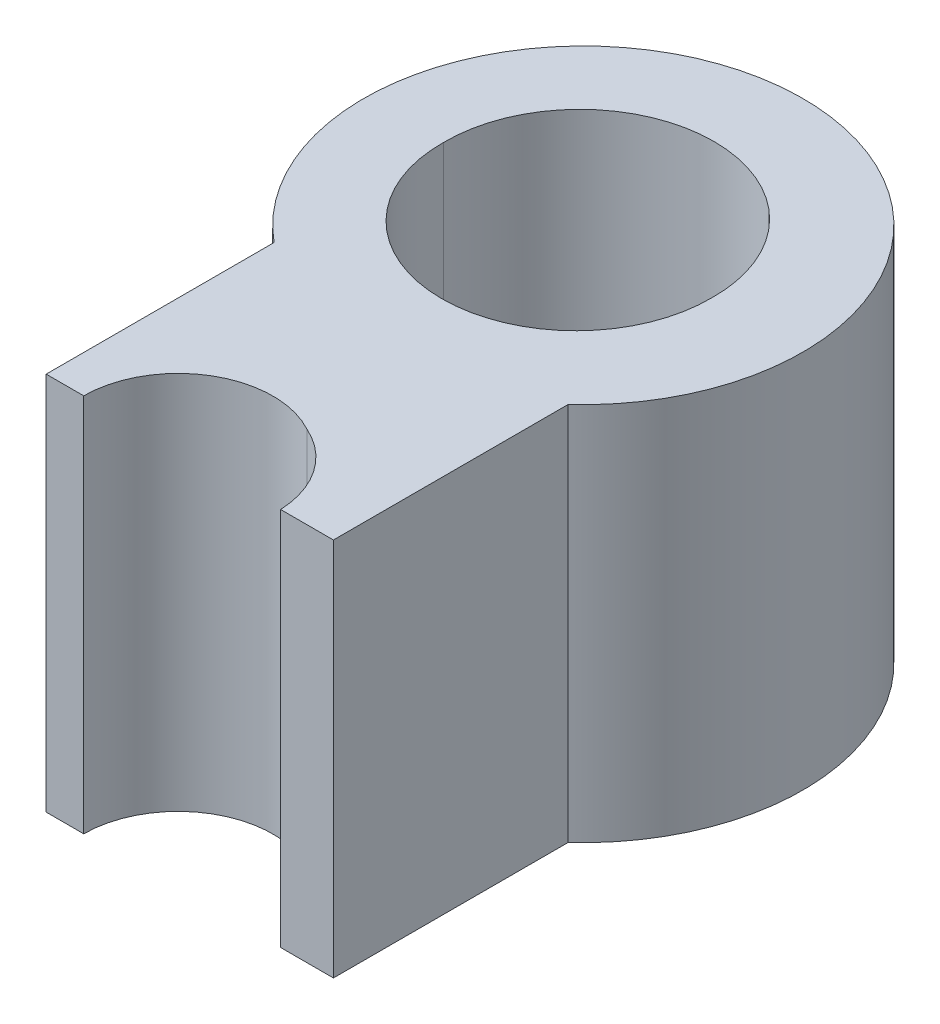
ISO-10303-21;
HEADER;
FILE_DESCRIPTION(('STEP AP214'),'2;1');
FILE_NAME('part.step','',(''),(''),'','','');
FILE_SCHEMA(('AUTOMOTIVE_DESIGN { 1 0 10303 214 1 1 1 1 }'));
ENDSEC;
DATA;
#1=APPLICATION_CONTEXT('core data for automotive mechanical design processes');
#2=APPLICATION_PROTOCOL_DEFINITION('international standard','automotive_design',2000,#1);
#3=PRODUCT_CONTEXT('',#1,'mechanical');
#4=PRODUCT('Part','Part','',(#3));
#5=PRODUCT_RELATED_PRODUCT_CATEGORY('part','',(#4));
#6=PRODUCT_DEFINITION_FORMATION('','',#4);
#7=PRODUCT_DEFINITION_CONTEXT('part definition',#1,'design');
#8=PRODUCT_DEFINITION('design','',#6,#7);
#9=PRODUCT_DEFINITION_SHAPE('','',#8);
#10=(LENGTH_UNIT() NAMED_UNIT(*) SI_UNIT(.MILLI.,.METRE.));
#11=(NAMED_UNIT(*) PLANE_ANGLE_UNIT() SI_UNIT($,.RADIAN.));
#12=(NAMED_UNIT(*) SI_UNIT($,.STERADIAN.) SOLID_ANGLE_UNIT());
#13=UNCERTAINTY_MEASURE_WITH_UNIT(LENGTH_MEASURE(1.E-05),#10,'distance_accuracy_value','');
#14=(GEOMETRIC_REPRESENTATION_CONTEXT(3) GLOBAL_UNCERTAINTY_ASSIGNED_CONTEXT((#13)) GLOBAL_UNIT_ASSIGNED_CONTEXT((#10,
#11,#12)) REPRESENTATION_CONTEXT('',''));
#15=CARTESIAN_POINT('',(0.,0.,0.));
#16=DIRECTION('',(0.,0.,1.));
#17=DIRECTION('',(1.,0.,0.));
#18=AXIS2_PLACEMENT_3D('',#15,#16,#17);
#19=CARTESIAN_POINT('',(1.26536763995187,2.87183105039429,15.59112871048));
#20=DIRECTION('',(0.,1.,0.));
#21=DIRECTION('',(0.,0.,-1.));
#22=AXIS2_PLACEMENT_3D('',#19,#20,#21);
#23=PLANE('',#22);
#24=CARTESIAN_POINT('',(6.25646763995183,2.87183105039429,23.2098996244558));
#25=DIRECTION('',(0.,1.,0.));
#26=DIRECTION('',(0.,0.,-1.));
#27=AXIS2_PLACEMENT_3D('',#24,#25,#26);
#28=CIRCLE('',#27,0.425);
#29=CARTESIAN_POINT('',(5.8315063422633,2.87183105039429,23.2041641674663));
#30=VERTEX_POINT('',#29);
#31=CARTESIAN_POINT('',(6.6814289376404,2.87183105039429,23.2041641674687));
#32=VERTEX_POINT('',#31);
#33=EDGE_CURVE('E208',#30,#32,#28,.T.);
#34=ORIENTED_EDGE('',*,*,#33,.F.);
#35=CARTESIAN_POINT('',(6.25646763995186,2.87183105039429,23.1984287104753));
#36=DIRECTION('',(0.,1.,0.));
#37=DIRECTION('',(0.,0.,1.));
#38=AXIS2_PLACEMENT_3D('',#35,#36,#37);
#39=CIRCLE('',#38,0.425);
#40=EDGE_CURVE('E115',#32,#30,#39,.T.);
#41=ORIENTED_EDGE('',*,*,#40,.F.);
#42=EDGE_LOOP('',(#34,#41));
#43=FACE_BOUND('',#42,.T.);
#44=CARTESIAN_POINT('',(6.27955042685121,2.87183105039429,24.4798996244558));
#45=DIRECTION('',(0.,1.,0.));
#46=DIRECTION('',(0.999103542626486,0.,-0.0423333333344553));
#47=AXIS2_PLACEMENT_3D('',#44,#45,#46);
#48=CIRCLE('',#47,0.299999999999992);
#49=CARTESIAN_POINT('',(6.57928148963915,2.87183105039429,24.4671996244555));
#50=VERTEX_POINT('',#49);
#51=CARTESIAN_POINT('',(6.40139322078209,2.87183105039429,24.2057567172575));
#52=VERTEX_POINT('',#51);
#53=EDGE_CURVE('E108',#50,#52,#48,.T.);
#54=ORIENTED_EDGE('',*,*,#53,.F.);
#55=DIRECTION('',(-1.,0.,-1.06337566312106E-12));
#56=VECTOR('',#55,1.);
#57=CARTESIAN_POINT('',(6.74636523073383,2.87183105039429,24.4671996244556));
#58=LINE('',#57,#56);
#59=CARTESIAN_POINT('',(6.74636523073383,2.87183105039429,24.4671996244556));
#60=VERTEX_POINT('',#59);
#61=EDGE_CURVE('E95',#60,#50,#58,.T.);
#62=ORIENTED_EDGE('',*,*,#61,.F.);
#63=DIRECTION('',(5.02522919053297E-13,0.,-1.));
#64=VECTOR('',#63,1.);
#65=CARTESIAN_POINT('',(6.74636523073383,2.87183105039429,24.4671996244556));
#66=LINE('',#65,#64);
#67=CARTESIAN_POINT('',(6.7463652307342,2.87183105039429,23.7245472516448));
#68=VERTEX_POINT('',#67);
#69=EDGE_CURVE('E26',#60,#68,#66,.T.);
#70=ORIENTED_EDGE('',*,*,#69,.T.);
#71=CARTESIAN_POINT('',(6.27955042685119,2.87183105039429,23.2098996244558));
#72=DIRECTION('',(0.,1.,0.));
#73=DIRECTION('',(0.,0.,-1.));
#74=AXIS2_PLACEMENT_3D('',#71,#72,#73);
#75=CIRCLE('',#74,0.694822453073876);
#76=CARTESIAN_POINT('',(5.83767133797172,2.87183105039429,23.7461095759735));
#77=VERTEX_POINT('',#76);
#78=EDGE_CURVE('E11',#68,#77,#75,.T.);
#79=ORIENTED_EDGE('',*,*,#78,.T.);
#80=DIRECTION('',(-5.6636748734305E-13,0.,-1.));
#81=VECTOR('',#80,1.);
#82=CARTESIAN_POINT('',(5.83767133797213,2.87183105039429,24.467199624456));
#83=LINE('',#82,#81);
#84=CARTESIAN_POINT('',(5.83767133797213,2.87183105039429,24.467199624456));
#85=VERTEX_POINT('',#84);
#86=EDGE_CURVE('E149',#85,#77,#83,.T.);
#87=ORIENTED_EDGE('',*,*,#86,.F.);
#88=DIRECTION('',(1.,0.,-1.62432664225037E-12));
#89=VECTOR('',#88,1.);
#90=CARTESIAN_POINT('',(5.83767133797213,2.87183105039429,24.467199624456));
#91=LINE('',#90,#89);
#92=CARTESIAN_POINT('',(5.9564701577165,2.87183105039429,24.4671996244558));
#93=VERTEX_POINT('',#92);
#94=EDGE_CURVE('E157',#85,#93,#91,.T.);
#95=ORIENTED_EDGE('',*,*,#94,.T.);
#96=CARTESIAN_POINT('',(6.25646763995186,2.87183105039429,24.4684287104753));
#97=DIRECTION('',(0.,1.,0.));
#98=DIRECTION('',(0.999103542626666,0.,0.04233333333019));
#99=AXIS2_PLACEMENT_3D('',#96,#97,#98);
#100=CIRCLE('',#99,0.300000000000009);
#101=EDGE_CURVE('E110',#52,#93,#100,.T.);
#102=ORIENTED_EDGE('',*,*,#101,.F.);
#103=EDGE_LOOP('',(#54,#62,#70,#79,#87,#95,#102));
#104=FACE_BOUND('',#103,.T.);
#105=ADVANCED_FACE('F17',(#43,#104),#23,.T.);
#106=CARTESIAN_POINT('',(6.27955042685119,2.87183105039429,23.2098996244558));
#107=DIRECTION('',(0.,-1.,0.));
#108=DIRECTION('',(0.,0.,-1.));
#109=AXIS2_PLACEMENT_3D('',#106,#107,#108);
#110=CYLINDRICAL_SURFACE('',#109,0.694822453073876);
#111=CARTESIAN_POINT('',(6.27955042685119,1.6718310055699,23.2098996244558));
#112=DIRECTION('',(0.,1.,0.));
#113=DIRECTION('',(0.,0.,-1.));
#114=AXIS2_PLACEMENT_3D('',#111,#112,#113);
#115=CIRCLE('',#114,0.694822453073876);
#116=CARTESIAN_POINT('',(6.74636523073421,1.6718310055699,23.7245472516448));
#117=VERTEX_POINT('',#116);
#118=CARTESIAN_POINT('',(5.83767133797173,1.6718310055699,23.7461095759735));
#119=VERTEX_POINT('',#118);
#120=EDGE_CURVE('E196',#117,#119,#115,.T.);
#121=ORIENTED_EDGE('',*,*,#120,.T.);
#122=DIRECTION('',(0.,-1.,0.));
#123=VECTOR('',#122,1.);
#124=CARTESIAN_POINT('',(5.83767133797172,2.87183105039429,23.7461095759735));
#125=LINE('',#124,#123);
#126=EDGE_CURVE('E153',#77,#119,#125,.T.);
#127=ORIENTED_EDGE('',*,*,#126,.F.);
#128=ORIENTED_EDGE('',*,*,#78,.F.);
#129=DIRECTION('',(0.,-1.,0.));
#130=VECTOR('',#129,1.);
#131=CARTESIAN_POINT('',(6.7463652307342,2.87183105039429,23.7245472516448));
#132=LINE('',#131,#130);
#133=EDGE_CURVE('E105',#68,#117,#132,.T.);
#134=ORIENTED_EDGE('',*,*,#133,.T.);
#135=EDGE_LOOP('',(#121,#127,#128,#134));
#136=FACE_BOUND('',#135,.T.);
#137=ADVANCED_FACE('F241',(#136),#110,.T.);
#138=CARTESIAN_POINT('',(6.7463652307342,2.87183105039429,23.7245472516448));
#139=DIRECTION('',(1.,0.,5.02522919053297E-13));
#140=DIRECTION('',(-5.02522919053297E-13,0.,1.));
#141=AXIS2_PLACEMENT_3D('',#138,#139,#140);
#142=PLANE('',#141);
#143=DIRECTION('',(5.02522919053297E-13,0.,-1.));
#144=VECTOR('',#143,1.);
#145=CARTESIAN_POINT('',(6.74636523073625,1.6718310055699,19.6578379810638));
#146=LINE('',#145,#144);
#147=CARTESIAN_POINT('',(6.74636523073384,1.6718310055699,24.4671996244556));
#148=VERTEX_POINT('',#147);
#149=EDGE_CURVE('E199',#148,#117,#146,.T.);
#150=ORIENTED_EDGE('',*,*,#149,.T.);
#151=ORIENTED_EDGE('',*,*,#133,.F.);
#152=ORIENTED_EDGE('',*,*,#69,.F.);
#153=DIRECTION('',(0.,-1.,0.));
#154=VECTOR('',#153,1.);
#155=CARTESIAN_POINT('',(6.74636523073383,2.87183105039429,24.4671996244556));
#156=LINE('',#155,#154);
#157=EDGE_CURVE('E102',#60,#148,#156,.T.);
#158=ORIENTED_EDGE('',*,*,#157,.T.);
#159=EDGE_LOOP('',(#150,#151,#152,#158));
#160=FACE_BOUND('',#159,.T.);
#161=ADVANCED_FACE('F246',(#160),#142,.T.);
#162=CARTESIAN_POINT('',(6.74636523073383,2.87183105039429,24.4671996244556));
#163=DIRECTION('',(-1.06337566312106E-12,0.,1.));
#164=DIRECTION('',(1.,0.,1.06337566312106E-12));
#165=AXIS2_PLACEMENT_3D('',#162,#163,#164);
#166=PLANE('',#165);
#167=DIRECTION('',(1.,0.,1.06337566312106E-12));
#168=VECTOR('',#167,1.);
#169=CARTESIAN_POINT('',(4.00586643533813,1.6718310055699,24.4671996244527));
#170=LINE('',#169,#168);
#171=CARTESIAN_POINT('',(6.57928148963915,1.6718310055699,24.4671996244555));
#172=VERTEX_POINT('',#171);
#173=EDGE_CURVE('E179',#172,#148,#170,.T.);
#174=ORIENTED_EDGE('',*,*,#173,.T.);
#175=ORIENTED_EDGE('',*,*,#157,.F.);
#176=ORIENTED_EDGE('',*,*,#61,.T.);
#177=DIRECTION('',(0.,-1.,0.));
#178=VECTOR('',#177,1.);
#179=CARTESIAN_POINT('',(6.57928148963915,2.87183105039429,24.4671996244555));
#180=LINE('',#179,#178);
#181=EDGE_CURVE('E100',#50,#172,#180,.T.);
#182=ORIENTED_EDGE('',*,*,#181,.T.);
#183=EDGE_LOOP('',(#174,#175,#176,#182));
#184=FACE_BOUND('',#183,.T.);
#185=ADVANCED_FACE('F98',(#184),#166,.T.);
#186=CARTESIAN_POINT('',(6.25646763995186,2.87183105039429,23.1984287104753));
#187=DIRECTION('',(0.,-1.,0.));
#188=DIRECTION('',(2.75833766230375E-12,0.,-1.));
#189=AXIS2_PLACEMENT_3D('',#186,#187,#188);
#190=CYLINDRICAL_SURFACE('',#189,0.425);
#191=CARTESIAN_POINT('',(6.25646763995186,1.6718310055699,23.1984287104753));
#192=DIRECTION('',(0.,-1.,0.));
#193=DIRECTION('',(0.,0.,1.));
#194=AXIS2_PLACEMENT_3D('',#191,#192,#193);
#195=CIRCLE('',#194,0.425);
#196=CARTESIAN_POINT('',(5.8315063422633,1.6718310055699,23.2041641674663));
#197=VERTEX_POINT('',#196);
#198=CARTESIAN_POINT('',(6.68142893764041,1.6718310055699,23.2041641674687));
#199=VERTEX_POINT('',#198);
#200=EDGE_CURVE('E189',#197,#199,#195,.T.);
#201=ORIENTED_EDGE('',*,*,#200,.T.);
#202=DIRECTION('',(0.,-1.,0.));
#203=VECTOR('',#202,1.);
#204=CARTESIAN_POINT('',(6.6814289376404,2.87183105039429,23.2041641674687));
#205=LINE('',#204,#203);
#206=EDGE_CURVE('E147',#32,#199,#205,.T.);
#207=ORIENTED_EDGE('',*,*,#206,.F.);
#208=ORIENTED_EDGE('',*,*,#40,.T.);
#209=DIRECTION('',(0.,-1.,0.));
#210=VECTOR('',#209,1.);
#211=CARTESIAN_POINT('',(5.8315063422633,2.87183105039429,23.2041641674663));
#212=LINE('',#211,#210);
#213=EDGE_CURVE('E204',#30,#197,#212,.T.);
#214=ORIENTED_EDGE('',*,*,#213,.T.);
#215=EDGE_LOOP('',(#201,#207,#208,#214));
#216=FACE_BOUND('',#215,.T.);
#217=ADVANCED_FACE('F230',(#216),#190,.F.);
#218=CARTESIAN_POINT('',(6.27955042685121,2.87183105039429,24.4798996244558));
#219=DIRECTION('',(0.,-1.,0.));
#220=DIRECTION('',(0.999103542626486,0.,-0.0423333333344553));
#221=AXIS2_PLACEMENT_3D('',#218,#219,#220);
#222=CYLINDRICAL_SURFACE('',#221,0.299999999999992);
#223=CARTESIAN_POINT('',(6.27955042685121,1.6718310055699,24.4798996244558));
#224=DIRECTION('',(0.,-1.,0.));
#225=DIRECTION('',(0.999103542626486,0.,-0.0423333333344553));
#226=AXIS2_PLACEMENT_3D('',#223,#224,#225);
#227=CIRCLE('',#226,0.299999999999992);
#228=CARTESIAN_POINT('',(6.40139322078209,1.6718310055699,24.2057567172575));
#229=VERTEX_POINT('',#228);
#230=EDGE_CURVE('E120',#229,#172,#227,.T.);
#231=ORIENTED_EDGE('',*,*,#230,.T.);
#232=ORIENTED_EDGE('',*,*,#181,.F.);
#233=ORIENTED_EDGE('',*,*,#53,.T.);
#234=DIRECTION('',(0.,-1.,0.));
#235=VECTOR('',#234,1.);
#236=CARTESIAN_POINT('',(6.40139322078209,2.87183105039429,24.2057567172575));
#237=LINE('',#236,#235);
#238=EDGE_CURVE('E127',#52,#229,#237,.T.);
#239=ORIENTED_EDGE('',*,*,#238,.T.);
#240=EDGE_LOOP('',(#231,#232,#233,#239));
#241=FACE_BOUND('',#240,.T.);
#242=ADVANCED_FACE('F118',(#241),#222,.F.);
#243=CARTESIAN_POINT('',(6.25646763995186,2.87183105039429,24.4684287104753));
#244=DIRECTION('',(0.,-1.,0.));
#245=DIRECTION('',(-0.506621950684995,0.,-0.862168312502919));
#246=AXIS2_PLACEMENT_3D('',#243,#244,#245);
#247=CYLINDRICAL_SURFACE('',#246,0.300000000000009);
#248=CARTESIAN_POINT('',(6.25646763995186,1.6718310055699,24.4684287104753));
#249=DIRECTION('',(0.,-1.,0.));
#250=DIRECTION('',(0.999103542626666,0.,0.04233333333019));
#251=AXIS2_PLACEMENT_3D('',#248,#249,#250);
#252=CIRCLE('',#251,0.300000000000009);
#253=CARTESIAN_POINT('',(5.95647015771651,1.6718310055699,24.4671996244558));
#254=VERTEX_POINT('',#253);
#255=EDGE_CURVE('E168',#254,#229,#252,.T.);
#256=ORIENTED_EDGE('',*,*,#255,.T.);
#257=ORIENTED_EDGE('',*,*,#238,.F.);
#258=ORIENTED_EDGE('',*,*,#101,.T.);
#259=DIRECTION('',(0.,-1.,0.));
#260=VECTOR('',#259,1.);
#261=CARTESIAN_POINT('',(5.9564701577165,2.87183105039429,24.4671996244558));
#262=LINE('',#261,#260);
#263=EDGE_CURVE('E155',#93,#254,#262,.T.);
#264=ORIENTED_EDGE('',*,*,#263,.T.);
#265=EDGE_LOOP('',(#256,#257,#258,#264));
#266=FACE_BOUND('',#265,.T.);
#267=ADVANCED_FACE('F169',(#266),#247,.F.);
#268=CARTESIAN_POINT('',(5.9564701577165,2.87183105039429,24.4671996244558));
#269=DIRECTION('',(1.62432664225037E-12,0.,1.));
#270=DIRECTION('',(1.,0.,-1.62432664225037E-12));
#271=AXIS2_PLACEMENT_3D('',#268,#269,#270);
#272=PLANE('',#271);
#273=DIRECTION('',(1.,0.,-1.62432664225037E-12));
#274=VECTOR('',#273,1.);
#275=CARTESIAN_POINT('',(3.6109188988414,1.6718310055699,24.4671996244596));
#276=LINE('',#275,#274);
#277=CARTESIAN_POINT('',(5.83767133797214,1.6718310055699,24.467199624456));
#278=VERTEX_POINT('',#277);
#279=EDGE_CURVE('E175',#278,#254,#276,.T.);
#280=ORIENTED_EDGE('',*,*,#279,.T.);
#281=ORIENTED_EDGE('',*,*,#263,.F.);
#282=ORIENTED_EDGE('',*,*,#94,.F.);
#283=DIRECTION('',(0.,-1.,0.));
#284=VECTOR('',#283,1.);
#285=CARTESIAN_POINT('',(5.83767133797213,2.87183105039429,24.467199624456));
#286=LINE('',#285,#284);
#287=EDGE_CURVE('E154',#85,#278,#286,.T.);
#288=ORIENTED_EDGE('',*,*,#287,.T.);
#289=EDGE_LOOP('',(#280,#281,#282,#288));
#290=FACE_BOUND('',#289,.T.);
#291=ADVANCED_FACE('F258',(#290),#272,.T.);
#292=CARTESIAN_POINT('',(5.83767133797213,2.87183105039429,24.467199624456));
#293=DIRECTION('',(-1.,0.,5.6636748734305E-13));
#294=DIRECTION('',(0.,1.,0.));
#295=AXIS2_PLACEMENT_3D('',#292,#293,#294);
#296=PLANE('',#295);
#297=DIRECTION('',(5.6636748734305E-13,0.,1.));
#298=VECTOR('',#297,1.);
#299=CARTESIAN_POINT('',(5.83767133796962,1.6718310055699,20.0291641674667));
#300=LINE('',#299,#298);
#301=EDGE_CURVE('E192',#119,#278,#300,.T.);
#302=ORIENTED_EDGE('',*,*,#301,.T.);
#303=ORIENTED_EDGE('',*,*,#287,.F.);
#304=ORIENTED_EDGE('',*,*,#86,.T.);
#305=ORIENTED_EDGE('',*,*,#126,.T.);
#306=EDGE_LOOP('',(#302,#303,#304,#305));
#307=FACE_BOUND('',#306,.T.);
#308=ADVANCED_FACE('F238',(#307),#296,.T.);
#309=CARTESIAN_POINT('',(6.25646763995183,2.87183105039429,23.2098996244558));
#310=DIRECTION('',(0.,-1.,0.));
#311=DIRECTION('',(-2.7587817515136E-12,0.,1.));
#312=AXIS2_PLACEMENT_3D('',#309,#310,#311);
#313=CYLINDRICAL_SURFACE('',#312,0.425);
#314=CARTESIAN_POINT('',(6.25646763995183,1.6718310055699,23.2098996244558));
#315=DIRECTION('',(0.,-1.,0.));
#316=DIRECTION('',(0.,0.,-1.));
#317=AXIS2_PLACEMENT_3D('',#314,#315,#316);
#318=CIRCLE('',#317,0.425);
#319=EDGE_CURVE('E185',#199,#197,#318,.T.);
#320=ORIENTED_EDGE('',*,*,#319,.T.);
#321=ORIENTED_EDGE('',*,*,#213,.F.);
#322=ORIENTED_EDGE('',*,*,#33,.T.);
#323=ORIENTED_EDGE('',*,*,#206,.T.);
#324=EDGE_LOOP('',(#320,#321,#322,#323));
#325=FACE_BOUND('',#324,.T.);
#326=ADVANCED_FACE('F226',(#325),#313,.F.);
#327=CARTESIAN_POINT('',(1.26536763995188,1.6718310055699,15.59112871048));
#328=DIRECTION('',(0.,1.,0.));
#329=DIRECTION('',(0.,0.,-1.));
#330=AXIS2_PLACEMENT_3D('',#327,#328,#329);
#331=PLANE('',#330);
#332=ORIENTED_EDGE('',*,*,#319,.F.);
#333=ORIENTED_EDGE('',*,*,#200,.F.);
#334=EDGE_LOOP('',(#332,#333));
#335=FACE_BOUND('',#334,.T.);
#336=ORIENTED_EDGE('',*,*,#230,.F.);
#337=ORIENTED_EDGE('',*,*,#255,.F.);
#338=ORIENTED_EDGE('',*,*,#279,.F.);
#339=ORIENTED_EDGE('',*,*,#301,.F.);
#340=ORIENTED_EDGE('',*,*,#120,.F.);
#341=ORIENTED_EDGE('',*,*,#149,.F.);
#342=ORIENTED_EDGE('',*,*,#173,.F.);
#343=EDGE_LOOP('',(#336,#337,#338,#339,#340,#341,#342));
#344=FACE_BOUND('',#343,.T.);
#345=ADVANCED_FACE('F177',(#335,#344),#331,.F.);
#346=CLOSED_SHELL('',(#105,#137,#161,#185,#217,#242,#267,#291,#308,#326,#345));
#347=MANIFOLD_SOLID_BREP('B1',#346);
#348=ADVANCED_BREP_SHAPE_REPRESENTATION('',(#18,#347),#14);
#349=SHAPE_DEFINITION_REPRESENTATION(#9,#348);
ENDSEC;
END-ISO-10303-21;
